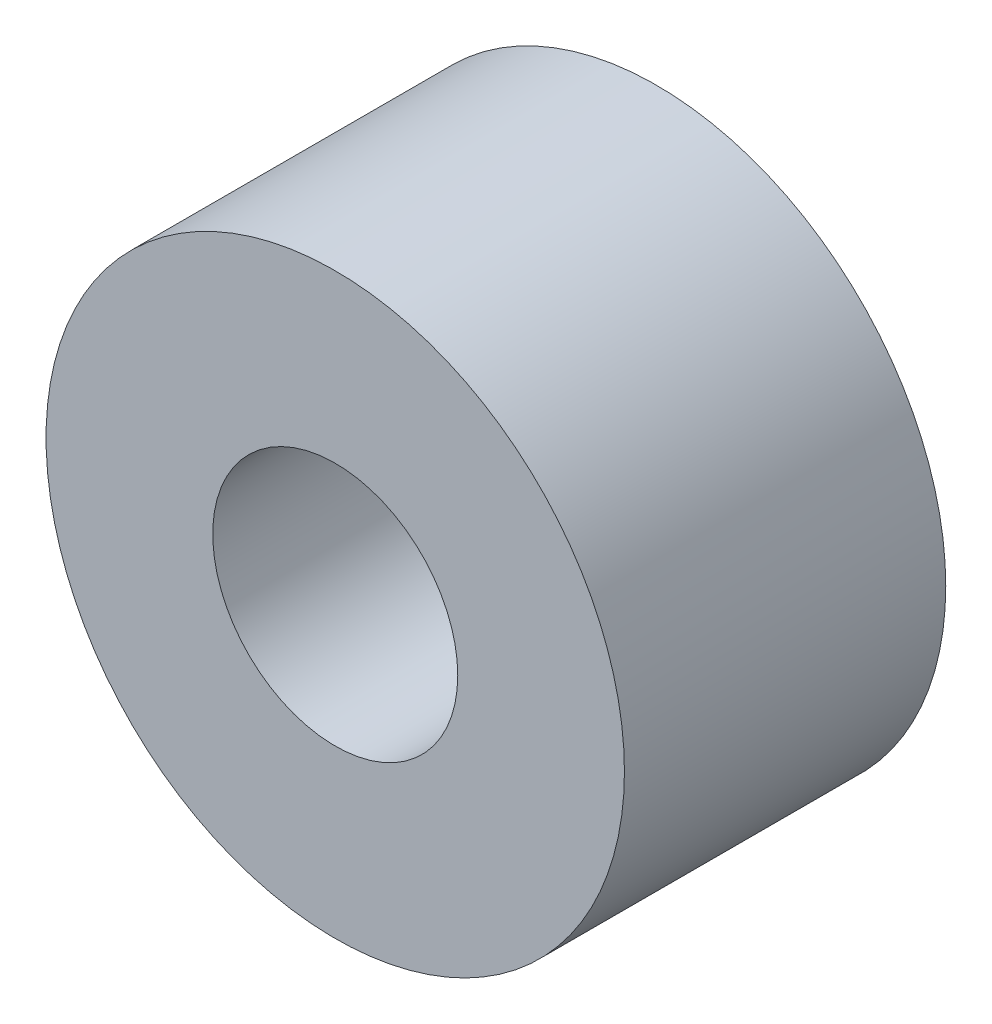
ISO-10303-21;
HEADER;
FILE_DESCRIPTION(('STEP AP214'),'2;1');
FILE_NAME('part.step','',(''),(''),'','','');
FILE_SCHEMA(('AUTOMOTIVE_DESIGN { 1 0 10303 214 1 1 1 1 }'));
ENDSEC;
DATA;
#1=APPLICATION_CONTEXT('core data for automotive mechanical design processes');
#2=APPLICATION_PROTOCOL_DEFINITION('international standard','automotive_design',2000,#1);
#3=PRODUCT_CONTEXT('',#1,'mechanical');
#4=PRODUCT('Part','Part','',(#3));
#5=PRODUCT_RELATED_PRODUCT_CATEGORY('part','',(#4));
#6=PRODUCT_DEFINITION_FORMATION('','',#4);
#7=PRODUCT_DEFINITION_CONTEXT('part definition',#1,'design');
#8=PRODUCT_DEFINITION('design','',#6,#7);
#9=PRODUCT_DEFINITION_SHAPE('','',#8);
#10=(LENGTH_UNIT() NAMED_UNIT(*) SI_UNIT(.MILLI.,.METRE.));
#11=(NAMED_UNIT(*) PLANE_ANGLE_UNIT() SI_UNIT($,.RADIAN.));
#12=(NAMED_UNIT(*) SI_UNIT($,.STERADIAN.) SOLID_ANGLE_UNIT());
#13=UNCERTAINTY_MEASURE_WITH_UNIT(LENGTH_MEASURE(1.E-05),#10,'distance_accuracy_value','');
#14=(GEOMETRIC_REPRESENTATION_CONTEXT(3) GLOBAL_UNCERTAINTY_ASSIGNED_CONTEXT((#13)) GLOBAL_UNIT_ASSIGNED_CONTEXT((#10,
#11,#12)) REPRESENTATION_CONTEXT('',''));
#15=CARTESIAN_POINT('',(0.,0.,0.));
#16=DIRECTION('',(0.,0.,1.));
#17=DIRECTION('',(1.,0.,0.));
#18=AXIS2_PLACEMENT_3D('',#15,#16,#17);
#19=CARTESIAN_POINT('',(0.,0.,4.));
#20=DIRECTION('',(0.,0.,1.));
#21=DIRECTION('',(1.,0.,0.));
#22=AXIS2_PLACEMENT_3D('',#19,#20,#21);
#23=PLANE('',#22);
#24=CARTESIAN_POINT('',(0.,0.,4.));
#25=DIRECTION('',(0.,0.,1.));
#26=DIRECTION('',(1.,0.,0.));
#27=AXIS2_PLACEMENT_3D('',#24,#25,#26);
#28=CIRCLE('',#27,3.6);
#29=CARTESIAN_POINT('',(3.6,0.,4.));
#30=VERTEX_POINT('',#29);
#31=EDGE_CURVE('E10',#30,#30,#28,.T.);
#32=ORIENTED_EDGE('',*,*,#31,.T.);
#33=EDGE_LOOP('',(#32));
#34=FACE_BOUND('',#33,.T.);
#35=CARTESIAN_POINT('',(0.,0.,4.));
#36=DIRECTION('',(0.,0.,1.));
#37=DIRECTION('',(1.,0.,0.));
#38=AXIS2_PLACEMENT_3D('',#35,#36,#37);
#39=CIRCLE('',#38,1.525);
#40=CARTESIAN_POINT('',(1.525,0.,4.));
#41=VERTEX_POINT('',#40);
#42=EDGE_CURVE('E44',#41,#41,#39,.T.);
#43=ORIENTED_EDGE('',*,*,#42,.F.);
#44=EDGE_LOOP('',(#43));
#45=FACE_BOUND('',#44,.T.);
#46=ADVANCED_FACE('F33',(#34,#45),#23,.T.);
#47=CARTESIAN_POINT('',(0.,0.,0.));
#48=DIRECTION('',(0.,0.,1.));
#49=DIRECTION('',(1.,0.,0.));
#50=AXIS2_PLACEMENT_3D('',#47,#48,#49);
#51=PLANE('',#50);
#52=CARTESIAN_POINT('',(0.,0.,0.));
#53=DIRECTION('',(0.,0.,1.));
#54=DIRECTION('',(1.,0.,0.));
#55=AXIS2_PLACEMENT_3D('',#52,#53,#54);
#56=CIRCLE('',#55,3.6);
#57=CARTESIAN_POINT('',(3.6,0.,0.));
#58=VERTEX_POINT('',#57);
#59=EDGE_CURVE('E37',#58,#58,#56,.T.);
#60=ORIENTED_EDGE('',*,*,#59,.F.);
#61=EDGE_LOOP('',(#60));
#62=FACE_BOUND('',#61,.T.);
#63=CARTESIAN_POINT('',(0.,0.,0.));
#64=DIRECTION('',(0.,0.,1.));
#65=DIRECTION('',(1.,0.,0.));
#66=AXIS2_PLACEMENT_3D('',#63,#64,#65);
#67=CIRCLE('',#66,1.525);
#68=CARTESIAN_POINT('',(1.525,0.,0.));
#69=VERTEX_POINT('',#68);
#70=EDGE_CURVE('E46',#69,#69,#67,.T.);
#71=ORIENTED_EDGE('',*,*,#70,.T.);
#72=EDGE_LOOP('',(#71));
#73=FACE_BOUND('',#72,.T.);
#74=ADVANCED_FACE('F56',(#62,#73),#51,.F.);
#75=CARTESIAN_POINT('',(0.,0.,4.));
#76=DIRECTION('',(0.,0.,-1.));
#77=DIRECTION('',(-1.,0.,0.));
#78=AXIS2_PLACEMENT_3D('',#75,#76,#77);
#79=CYLINDRICAL_SURFACE('',#78,3.6);
#80=ORIENTED_EDGE('',*,*,#31,.F.);
#81=EDGE_LOOP('',(#80));
#82=FACE_BOUND('',#81,.T.);
#83=ORIENTED_EDGE('',*,*,#59,.T.);
#84=EDGE_LOOP('',(#83));
#85=FACE_BOUND('',#84,.T.);
#86=ADVANCED_FACE('F35',(#82,#85),#79,.T.);
#87=CARTESIAN_POINT('',(0.,0.,4.));
#88=DIRECTION('',(0.,0.,-1.));
#89=DIRECTION('',(-1.,0.,0.));
#90=AXIS2_PLACEMENT_3D('',#87,#88,#89);
#91=CYLINDRICAL_SURFACE('',#90,1.525);
#92=ORIENTED_EDGE('',*,*,#42,.T.);
#93=EDGE_LOOP('',(#92));
#94=FACE_BOUND('',#93,.T.);
#95=ORIENTED_EDGE('',*,*,#70,.F.);
#96=EDGE_LOOP('',(#95));
#97=FACE_BOUND('',#96,.T.);
#98=ADVANCED_FACE('F52',(#94,#97),#91,.F.);
#99=CLOSED_SHELL('',(#46,#74,#86,#98));
#100=MANIFOLD_SOLID_BREP('B2',#99);
#101=ADVANCED_BREP_SHAPE_REPRESENTATION('',(#18,#100),#14);
#102=SHAPE_DEFINITION_REPRESENTATION(#9,#101);
ENDSEC;
END-ISO-10303-21;
